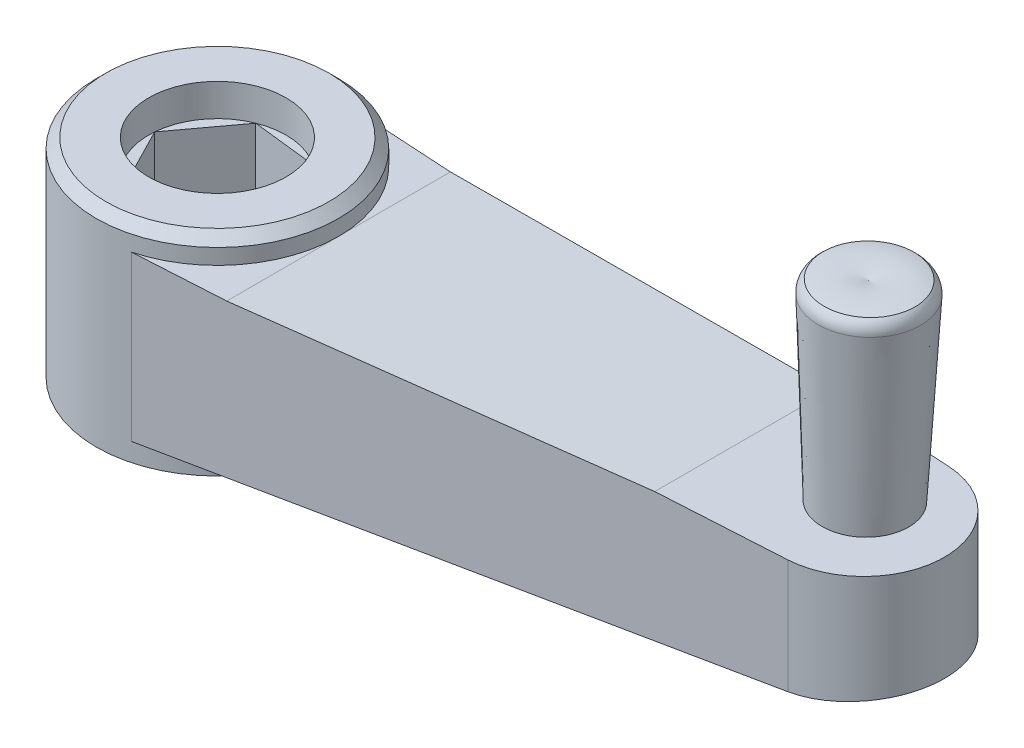
ISO-10303-21;
HEADER;
FILE_DESCRIPTION(('STEP AP214'),'2;1');
FILE_NAME('part.step','',(''),(''),'','','');
FILE_SCHEMA(('AUTOMOTIVE_DESIGN { 1 0 10303 214 1 1 1 1 }'));
ENDSEC;
DATA;
#1=APPLICATION_CONTEXT('core data for automotive mechanical design processes');
#2=APPLICATION_PROTOCOL_DEFINITION('international standard','automotive_design',2000,#1);
#3=PRODUCT_CONTEXT('',#1,'mechanical');
#4=PRODUCT('Part','Part','',(#3));
#5=PRODUCT_RELATED_PRODUCT_CATEGORY('part','',(#4));
#6=PRODUCT_DEFINITION_FORMATION('','',#4);
#7=PRODUCT_DEFINITION_CONTEXT('part definition',#1,'design');
#8=PRODUCT_DEFINITION('design','',#6,#7);
#9=PRODUCT_DEFINITION_SHAPE('','',#8);
#10=(LENGTH_UNIT() NAMED_UNIT(*) SI_UNIT(.MILLI.,.METRE.));
#11=(NAMED_UNIT(*) PLANE_ANGLE_UNIT() SI_UNIT($,.RADIAN.));
#12=(NAMED_UNIT(*) SI_UNIT($,.STERADIAN.) SOLID_ANGLE_UNIT());
#13=UNCERTAINTY_MEASURE_WITH_UNIT(LENGTH_MEASURE(1.E-05),#10,'distance_accuracy_value','');
#14=(GEOMETRIC_REPRESENTATION_CONTEXT(3) GLOBAL_UNCERTAINTY_ASSIGNED_CONTEXT((#13)) GLOBAL_UNIT_ASSIGNED_CONTEXT((#10,
#11,#12)) REPRESENTATION_CONTEXT('',''));
#15=CARTESIAN_POINT('',(0.,0.,0.));
#16=DIRECTION('',(0.,0.,1.));
#17=DIRECTION('',(1.,0.,0.));
#18=AXIS2_PLACEMENT_3D('',#15,#16,#17);
#19=CARTESIAN_POINT('',(8.5,22.,0.));
#20=DIRECTION('',(0.,1.,0.));
#21=DIRECTION('',(0.,0.,1.));
#22=AXIS2_PLACEMENT_3D('',#19,#20,#21);
#23=PLANE('',#22);
#24=DIRECTION('',(0.456272844819986,0.,0.889839924413306));
#25=VECTOR('',#24,1.);
#26=CARTESIAN_POINT('',(-4.64982391010304,22.,6.74268191360427));
#27=LINE('',#26,#25);
#28=CARTESIAN_POINT('',(-8.47042900631738,22.,-0.708401333240643));
#29=VERTEX_POINT('',#28);
#30=CARTESIAN_POINT('',(-4.36836226553078,22.,7.29159866675936));
#31=VERTEX_POINT('',#30);
#32=EDGE_CURVE('E41',#29,#31,#27,.T.);
#33=ORIENTED_EDGE('',*,*,#32,.F.);
#34=CARTESIAN_POINT('',(0.,22.,0.));
#35=DIRECTION('',(0.,1.,0.));
#36=DIRECTION('',(0.,0.,1.));
#37=AXIS2_PLACEMENT_3D('',#34,#35,#36);
#38=CIRCLE('',#37,8.5);
#39=EDGE_CURVE('E268',#29,#31,#38,.T.);
#40=ORIENTED_EDGE('',*,*,#39,.T.);
#41=EDGE_LOOP('',(#33,#40));
#42=FACE_BOUND('',#41,.T.);
#43=ADVANCED_FACE('F33',(#42),#23,.T.);
#44=DIRECTION('',(-0.594958696561607,0.,0.80375627486553));
#45=VECTOR('',#44,1.);
#46=CARTESIAN_POINT('',(-2.80206574602736,22.,-8.36604641853031));
#47=LINE('',#46,#45);
#48=CARTESIAN_POINT('',(-3.15129194618021,22.,-7.89426114781743));
#49=VERTEX_POINT('',#48);
#50=EDGE_CURVE('E258',#49,#29,#47,.T.);
#51=ORIENTED_EDGE('',*,*,#50,.F.);
#52=EDGE_CURVE('E273',#49,#29,#38,.T.);
#53=ORIENTED_EDGE('',*,*,#52,.T.);
#54=EDGE_LOOP('',(#51,#53));
#55=FACE_BOUND('',#54,.T.);
#56=ADVANCED_FACE('F277',(#55),#23,.T.);
#57=DIRECTION('',(-0.993552700765501,0.,-0.11337120799206));
#58=VECTOR('',#57,1.);
#59=CARTESIAN_POINT('',(9.23945729200637,22.,-6.48039129674904));
#60=LINE('',#59,#58);
#61=CARTESIAN_POINT('',(4.84870805381979,22.,-6.98140603380315));
#62=VERTEX_POINT('',#61);
#63=EDGE_CURVE('E256',#62,#49,#60,.T.);
#64=ORIENTED_EDGE('',*,*,#63,.F.);
#65=EDGE_CURVE('E278',#62,#49,#38,.T.);
#66=ORIENTED_EDGE('',*,*,#65,.T.);
#67=EDGE_LOOP('',(#64,#66));
#68=FACE_BOUND('',#67,.T.);
#69=ADVANCED_FACE('F308',(#68),#23,.T.);
#70=DIRECTION('',(-0.456272844819993,0.,-0.889839924413302));
#71=VECTOR('',#70,1.);
#72=CARTESIAN_POINT('',(8.44337115892086,22.,0.0290369106950027));
#73=LINE('',#72,#71);
#74=CARTESIAN_POINT('',(8.49889081237974,22.,0.137313361503261));
#75=VERTEX_POINT('',#74);
#76=EDGE_CURVE('E254',#75,#62,#73,.T.);
#77=ORIENTED_EDGE('',*,*,#76,.F.);
#78=EDGE_CURVE('E182',#75,#62,#38,.T.);
#79=ORIENTED_EDGE('',*,*,#78,.T.);
#80=EDGE_LOOP('',(#77,#79));
#81=FACE_BOUND('',#80,.T.);
#82=ADVANCED_FACE('F285',(#81),#23,.T.);
#83=DIRECTION('',(0.542487557433548,0.,-0.840063836877759));
#84=VECTOR('',#83,1.);
#85=CARTESIAN_POINT('',(8.56179425718551,22.,0.0399048431468962));
#86=LINE('',#85,#84);
#87=CARTESIAN_POINT('',(3.62172095249758,22.,7.68980736704373));
#88=VERTEX_POINT('',#87);
#89=EDGE_CURVE('E252',#88,#75,#86,.T.);
#90=ORIENTED_EDGE('',*,*,#89,.F.);
#91=EDGE_CURVE('E178',#88,#75,#38,.T.);
#92=ORIENTED_EDGE('',*,*,#91,.T.);
#93=EDGE_LOOP('',(#90,#92));
#94=FACE_BOUND('',#93,.T.);
#95=ADVANCED_FACE('F288',(#94),#23,.T.);
#96=CARTESIAN_POINT('',(0.,26.,0.));
#97=DIRECTION('',(0.,1.,0.));
#98=DIRECTION('',(0.,0.,1.));
#99=AXIS2_PLACEMENT_3D('',#96,#97,#98);
#100=PLANE('',#99);
#101=DIRECTION('',(0.,0.,-1.));
#102=VECTOR('',#101,1.);
#103=CARTESIAN_POINT('',(65.0291545189505,26.,0.));
#104=LINE('',#103,#102);
#105=CARTESIAN_POINT('',(65.0291545189505,26.,10.8983616176253));
#106=VERTEX_POINT('',#105);
#107=CARTESIAN_POINT('',(65.0291545189505,26.,-10.8983616176253));
#108=VERTEX_POINT('',#107);
#109=EDGE_CURVE('E235',#106,#108,#104,.T.);
#110=ORIENTED_EDGE('',*,*,#109,.F.);
#111=DIRECTION('',(0.998272727014016,0.,-0.05875));
#112=VECTOR('',#111,1.);
#113=CARTESIAN_POINT('',(0.863625,26.,14.674609087106));
#114=LINE('',#113,#112);
#115=CARTESIAN_POINT('',(80.5875,26.,9.98272727014016));
#116=VERTEX_POINT('',#115);
#117=EDGE_CURVE('E223',#106,#116,#114,.T.);
#118=ORIENTED_EDGE('',*,*,#117,.T.);
#119=CARTESIAN_POINT('',(80.,26.,0.));
#120=DIRECTION('',(0.,1.,0.));
#121=DIRECTION('',(0.,0.,1.));
#122=AXIS2_PLACEMENT_3D('',#119,#120,#121);
#123=CIRCLE('',#122,10.);
#124=CARTESIAN_POINT('',(80.5875,26.,-9.98272727014016));
#125=VERTEX_POINT('',#124);
#126=EDGE_CURVE('E226',#116,#125,#123,.T.);
#127=ORIENTED_EDGE('',*,*,#126,.T.);
#128=DIRECTION('',(-0.998272727014016,0.,-0.05875));
#129=VECTOR('',#128,1.);
#130=CARTESIAN_POINT('',(80.5875,26.,-9.98272727014016));
#131=LINE('',#130,#129);
#132=EDGE_CURVE('E229',#125,#108,#131,.T.);
#133=ORIENTED_EDGE('',*,*,#132,.T.);
#134=EDGE_LOOP('',(#110,#118,#127,#133));
#135=FACE_BOUND('',#134,.T.);
#136=CARTESIAN_POINT('',(80.1181305874292,26.,0.));
#137=DIRECTION('',(0.,1.,0.));
#138=DIRECTION('',(-1.,0.,0.));
#139=AXIS2_PLACEMENT_3D('',#136,#137,#138);
#140=ELLIPSE('',#139,2.88186941257082,2.88118920826868);
#141=CARTESIAN_POINT('',(77.2362611748584,26.,0.));
#142=VERTEX_POINT('',#141);
#143=EDGE_CURVE('E177',#142,#142,#140,.F.);
#144=ORIENTED_EDGE('',*,*,#143,.T.);
#145=EDGE_LOOP('',(#144));
#146=FACE_BOUND('',#145,.T.);
#147=ADVANCED_FACE('F321',(#135,#146),#100,.T.);
#148=CARTESIAN_POINT('',(0.,26.,0.));
#149=DIRECTION('',(0.,-1.,0.));
#150=DIRECTION('',(0.,0.,-1.));
#151=AXIS2_PLACEMENT_3D('',#148,#149,#150);
#152=PLANE('',#151);
#153=CARTESIAN_POINT('',(0.,26.,0.));
#154=DIRECTION('',(0.,1.,0.));
#155=DIRECTION('',(0.,0.,1.));
#156=AXIS2_PLACEMENT_3D('',#153,#154,#155);
#157=CIRCLE('',#156,13.8);
#158=CARTESIAN_POINT('',(0.,26.,13.8));
#159=VERTEX_POINT('',#158);
#160=EDGE_CURVE('E196',#159,#159,#157,.T.);
#161=ORIENTED_EDGE('',*,*,#160,.T.);
#162=EDGE_LOOP('',(#161));
#163=FACE_BOUND('',#162,.T.);
#164=CARTESIAN_POINT('',(0.,26.,0.));
#165=DIRECTION('',(0.,-1.,0.));
#166=DIRECTION('',(0.,0.,-1.));
#167=AXIS2_PLACEMENT_3D('',#164,#165,#166);
#168=CIRCLE('',#167,8.5);
#169=CARTESIAN_POINT('',(0.,26.,-8.5));
#170=VERTEX_POINT('',#169);
#171=EDGE_CURVE('E181',#170,#170,#168,.F.);
#172=ORIENTED_EDGE('',*,*,#171,.F.);
#173=EDGE_LOOP('',(#172));
#174=FACE_BOUND('',#173,.T.);
#175=ADVANCED_FACE('F326',(#163,#174),#152,.F.);
#176=CARTESIAN_POINT('',(80.5875,0.300000000000002,-9.98272727014016));
#177=DIRECTION('',(0.0587499999999999,0.,-0.998272727014016));
#178=DIRECTION('',(-0.998272727014016,0.,-0.0587499999999999));
#179=AXIS2_PLACEMENT_3D('',#176,#177,#178);
#180=PLANE('',#179);
#181=DIRECTION('',(0.991087002244832,0.119768536886839,0.0583271082202633));
#182=VECTOR('',#181,1.);
#183=CARTESIAN_POINT('',(79.2151578637604,11.6954904608239,-10.0634918731613));
#184=LINE('',#183,#182);
#185=CARTESIAN_POINT('',(3.84343146655537,2.58714641758488,-14.499242551316));
#186=VERTEX_POINT('',#185);
#187=CARTESIAN_POINT('',(80.5875,11.8613320159985,-9.98272727014016));
#188=VERTEX_POINT('',#187);
#189=EDGE_CURVE('E210',#186,#188,#184,.T.);
#190=ORIENTED_EDGE('',*,*,#189,.F.);
#191=DIRECTION('',(0.,1.,0.));
#192=VECTOR('',#191,1.);
#193=CARTESIAN_POINT('',(3.84343146655534,0.,-14.499242551316));
#194=LINE('',#193,#192);
#195=CARTESIAN_POINT('',(3.84343146655534,22.88,-14.499242551316));
#196=VERTEX_POINT('',#195);
#197=EDGE_CURVE('E202',#186,#196,#194,.T.);
#198=ORIENTED_EDGE('',*,*,#197,.T.);
#199=DIRECTION('',(-0.998272727014016,0.,-0.0587499999999999));
#200=VECTOR('',#199,1.);
#201=CARTESIAN_POINT('',(80.5875,22.88,-9.98272727014016));
#202=LINE('',#201,#200);
#203=CARTESIAN_POINT('',(15.0000000000001,22.88,-13.8426600527633));
#204=VERTEX_POINT('',#203);
#205=EDGE_CURVE('E220',#204,#196,#202,.T.);
#206=ORIENTED_EDGE('',*,*,#205,.F.);
#207=DIRECTION('',(-0.996343780024752,-0.0621356211906346,-0.0586364782813828));
#208=VECTOR('',#207,1.);
#209=CARTESIAN_POINT('',(78.9363848886131,26.867305457599,-10.0798981235242));
#210=LINE('',#209,#208);
#211=EDGE_CURVE('E218',#108,#204,#210,.T.);
#212=ORIENTED_EDGE('',*,*,#211,.F.);
#213=ORIENTED_EDGE('',*,*,#132,.F.);
#214=DIRECTION('',(0.,1.,0.));
#215=VECTOR('',#214,1.);
#216=CARTESIAN_POINT('',(80.5875,0.300000000000002,-9.98272727014016));
#217=LINE('',#216,#215);
#218=EDGE_CURVE('E233',#188,#125,#217,.T.);
#219=ORIENTED_EDGE('',*,*,#218,.F.);
#220=EDGE_LOOP('',(#190,#198,#206,#212,#213,#219));
#221=FACE_BOUND('',#220,.T.);
#222=ADVANCED_FACE('F470',(#221),#180,.T.);
#223=CARTESIAN_POINT('',(0.863625,0.300000000000002,14.674609087106));
#224=DIRECTION('',(0.05875,0.,0.998272727014016));
#225=DIRECTION('',(0.998272727014016,0.,-0.05875));
#226=AXIS2_PLACEMENT_3D('',#223,#224,#225);
#227=PLANE('',#226);
#228=DIRECTION('',(0.998272727014016,0.,-0.05875));
#229=VECTOR('',#228,1.);
#230=CARTESIAN_POINT('',(0.863624999999998,22.88,14.674609087106));
#231=LINE('',#230,#229);
#232=CARTESIAN_POINT('',(3.84343146655534,22.88,14.499242551316));
#233=VERTEX_POINT('',#232);
#234=CARTESIAN_POINT('',(15.0000000000001,22.88,13.8426600527633));
#235=VERTEX_POINT('',#234);
#236=EDGE_CURVE('E238',#233,#235,#231,.T.);
#237=ORIENTED_EDGE('',*,*,#236,.F.);
#238=DIRECTION('',(0.,1.,0.));
#239=VECTOR('',#238,1.);
#240=CARTESIAN_POINT('',(3.84343146655534,0.,14.499242551316));
#241=LINE('',#240,#239);
#242=CARTESIAN_POINT('',(3.84343146655533,2.58714641758487,14.499242551316));
#243=VERTEX_POINT('',#242);
#244=EDGE_CURVE('E199',#233,#243,#241,.F.);
#245=ORIENTED_EDGE('',*,*,#244,.T.);
#246=DIRECTION('',(-0.991087002244832,-0.119768536886839,0.0583271082202633));
#247=VECTOR('',#246,1.);
#248=CARTESIAN_POINT('',(0.634882182268532,2.1994072459098,14.6880709800117));
#249=LINE('',#248,#247);
#250=CARTESIAN_POINT('',(80.5875,11.8613320159985,9.98272727014016));
#251=VERTEX_POINT('',#250);
#252=EDGE_CURVE('E241',#251,#243,#249,.T.);
#253=ORIENTED_EDGE('',*,*,#252,.F.);
#254=DIRECTION('',(0.,1.,0.));
#255=VECTOR('',#254,1.);
#256=CARTESIAN_POINT('',(80.5875,0.300000000000002,9.98272727014016));
#257=LINE('',#256,#255);
#258=EDGE_CURVE('E232',#251,#116,#257,.T.);
#259=ORIENTED_EDGE('',*,*,#258,.T.);
#260=ORIENTED_EDGE('',*,*,#117,.F.);
#261=DIRECTION('',(0.996343780024752,0.0621356211906346,-0.0586364782813828));
#262=VECTOR('',#261,1.);
#263=CARTESIAN_POINT('',(-0.479689350907768,21.9146302822979,14.7536653569812));
#264=LINE('',#263,#262);
#265=EDGE_CURVE('E216',#235,#106,#264,.T.);
#266=ORIENTED_EDGE('',*,*,#265,.F.);
#267=EDGE_LOOP('',(#237,#245,#253,#259,#260,#266));
#268=FACE_BOUND('',#267,.T.);
#269=ADVANCED_FACE('F482',(#268),#227,.T.);
#270=CARTESIAN_POINT('',(-21.,22.88,-80.));
#271=DIRECTION('',(0.,-1.,0.));
#272=DIRECTION('',(1.,0.,0.));
#273=AXIS2_PLACEMENT_3D('',#270,#271,#272);
#274=PLANE('',#273);
#275=CARTESIAN_POINT('',(0.,22.88,0.));
#276=DIRECTION('',(0.,-1.,0.));
#277=DIRECTION('',(1.,0.,0.));
#278=AXIS2_PLACEMENT_3D('',#275,#276,#277);
#279=CIRCLE('',#278,15.);
#280=CARTESIAN_POINT('',(15.0000000000001,22.88,0.));
#281=VERTEX_POINT('',#280);
#282=EDGE_CURVE('E207',#281,#196,#279,.F.);
#283=ORIENTED_EDGE('',*,*,#282,.F.);
#284=DIRECTION('',(0.,0.,1.));
#285=VECTOR('',#284,1.);
#286=CARTESIAN_POINT('',(15.0000000000001,22.88,-80.));
#287=LINE('',#286,#285);
#288=EDGE_CURVE('E213',#204,#281,#287,.T.);
#289=ORIENTED_EDGE('',*,*,#288,.F.);
#290=ORIENTED_EDGE('',*,*,#205,.T.);
#291=EDGE_LOOP('',(#283,#289,#290));
#292=FACE_BOUND('',#291,.T.);
#293=ADVANCED_FACE('F491',(#292),#274,.F.);
#294=EDGE_CURVE('E204',#233,#281,#279,.F.);
#295=ORIENTED_EDGE('',*,*,#294,.F.);
#296=ORIENTED_EDGE('',*,*,#236,.T.);
#297=EDGE_CURVE('E212',#281,#235,#287,.T.);
#298=ORIENTED_EDGE('',*,*,#297,.F.);
#299=EDGE_LOOP('',(#295,#296,#298));
#300=FACE_BOUND('',#299,.T.);
#301=ADVANCED_FACE('F498',(#300),#274,.F.);
#302=CARTESIAN_POINT('',(90.01,13.,-80.));
#303=DIRECTION('',(-0.1199727875568,0.992777180562613,0.));
#304=DIRECTION('',(-0.992777180562613,-0.1199727875568,0.));
#305=AXIS2_PLACEMENT_3D('',#302,#303,#304);
#306=PLANE('',#305);
#307=CARTESIAN_POINT('',(0.,2.1226845062375,0.));
#308=DIRECTION('',(-0.1199727875568,0.992777180562613,0.));
#309=DIRECTION('',(0.992777180562613,0.1199727875568,0.));
#310=AXIS2_PLACEMENT_3D('',#307,#308,#309);
#311=ELLIPSE('',#310,15.1091305216135,15.);
#312=EDGE_CURVE('E243',#186,#243,#311,.F.);
#313=ORIENTED_EDGE('',*,*,#312,.F.);
#314=ORIENTED_EDGE('',*,*,#189,.T.);
#315=CARTESIAN_POINT('',(80.,11.7903352061708,0.));
#316=DIRECTION('',(-0.1199727875568,0.992777180562613,0.));
#317=DIRECTION('',(0.992777180562613,0.1199727875568,0.));
#318=AXIS2_PLACEMENT_3D('',#315,#316,#317);
#319=ELLIPSE('',#318,10.0727536810757,10.);
#320=EDGE_CURVE('E208',#188,#251,#319,.F.);
#321=ORIENTED_EDGE('',*,*,#320,.T.);
#322=ORIENTED_EDGE('',*,*,#252,.T.);
#323=EDGE_LOOP('',(#313,#314,#321,#322));
#324=FACE_BOUND('',#323,.T.);
#325=ADVANCED_FACE('F506',(#324),#306,.F.);
#326=CARTESIAN_POINT('',(80.,0.300000000000002,0.));
#327=DIRECTION('',(0.,1.,0.));
#328=DIRECTION('',(0.,0.,1.));
#329=AXIS2_PLACEMENT_3D('',#326,#327,#328);
#330=CYLINDRICAL_SURFACE('',#329,10.);
#331=ORIENTED_EDGE('',*,*,#320,.F.);
#332=ORIENTED_EDGE('',*,*,#218,.T.);
#333=ORIENTED_EDGE('',*,*,#126,.F.);
#334=ORIENTED_EDGE('',*,*,#258,.F.);
#335=EDGE_LOOP('',(#331,#332,#333,#334));
#336=FACE_BOUND('',#335,.T.);
#337=ADVANCED_FACE('F513',(#336),#330,.T.);
#338=CARTESIAN_POINT('',(15.0000000000001,22.88,-80.));
#339=DIRECTION('',(0.0622427159156604,-0.998061042379394,0.));
#340=DIRECTION('',(0.998061042379394,0.0622427159156604,0.));
#341=AXIS2_PLACEMENT_3D('',#338,#339,#340);
#342=PLANE('',#341);
#343=ORIENTED_EDGE('',*,*,#211,.T.);
#344=ORIENTED_EDGE('',*,*,#288,.T.);
#345=ORIENTED_EDGE('',*,*,#297,.T.);
#346=ORIENTED_EDGE('',*,*,#265,.T.);
#347=ORIENTED_EDGE('',*,*,#109,.T.);
#348=EDGE_LOOP('',(#343,#344,#345,#346,#347));
#349=FACE_BOUND('',#348,.T.);
#350=ADVANCED_FACE('F521',(#349),#342,.F.);
#351=CARTESIAN_POINT('',(0.,0.,0.));
#352=DIRECTION('',(0.,1.,0.));
#353=DIRECTION('',(0.,0.,1.));
#354=AXIS2_PLACEMENT_3D('',#351,#352,#353);
#355=CYLINDRICAL_SURFACE('',#354,15.);
#356=CARTESIAN_POINT('',(0.,0.300000000000001,0.));
#357=DIRECTION('',(0.,1.,0.));
#358=DIRECTION('',(0.,0.,1.));
#359=AXIS2_PLACEMENT_3D('',#356,#357,#358);
#360=CIRCLE('',#359,15.);
#361=CARTESIAN_POINT('',(0.,0.300000000000001,15.));
#362=VERTEX_POINT('',#361);
#363=EDGE_CURVE('E190',#362,#362,#360,.T.);
#364=ORIENTED_EDGE('',*,*,#363,.T.);
#365=EDGE_LOOP('',(#364));
#366=FACE_BOUND('',#365,.T.);
#367=CARTESIAN_POINT('',(0.,24.8,0.));
#368=DIRECTION('',(0.,1.,0.));
#369=DIRECTION('',(0.,0.,1.));
#370=AXIS2_PLACEMENT_3D('',#367,#368,#369);
#371=CIRCLE('',#370,15.);
#372=CARTESIAN_POINT('',(0.,24.8,15.));
#373=VERTEX_POINT('',#372);
#374=EDGE_CURVE('E193',#373,#373,#371,.T.);
#375=ORIENTED_EDGE('',*,*,#374,.F.);
#376=EDGE_LOOP('',(#375));
#377=FACE_BOUND('',#376,.T.);
#378=ORIENTED_EDGE('',*,*,#294,.T.);
#379=ORIENTED_EDGE('',*,*,#282,.T.);
#380=ORIENTED_EDGE('',*,*,#197,.F.);
#381=ORIENTED_EDGE('',*,*,#312,.T.);
#382=ORIENTED_EDGE('',*,*,#244,.F.);
#383=EDGE_LOOP('',(#378,#379,#380,#381,#382));
#384=FACE_BOUND('',#383,.T.);
#385=ADVANCED_FACE('F528',(#366,#377,#384),#355,.T.);
#386=CARTESIAN_POINT('',(0.,24.8,0.));
#387=DIRECTION('',(0.,-1.,0.));
#388=DIRECTION('',(0.,0.,-1.));
#389=AXIS2_PLACEMENT_3D('',#386,#387,#388);
#390=CONICAL_SURFACE('',#389,15.,0.785398163397448);
#391=ORIENTED_EDGE('',*,*,#160,.F.);
#392=EDGE_LOOP('',(#391));
#393=FACE_BOUND('',#392,.T.);
#394=ORIENTED_EDGE('',*,*,#374,.T.);
#395=EDGE_LOOP('',(#394));
#396=FACE_BOUND('',#395,.T.);
#397=ADVANCED_FACE('F536',(#393,#396),#390,.T.);
#398=CARTESIAN_POINT('',(15.,0.3,0.));
#399=DIRECTION('',(0.,1.,0.));
#400=DIRECTION('',(0.,0.,1.));
#401=AXIS2_PLACEMENT_3D('',#398,#399,#400);
#402=PLANE('',#401);
#403=ORIENTED_EDGE('',*,*,#363,.F.);
#404=EDGE_LOOP('',(#403));
#405=FACE_BOUND('',#404,.T.);
#406=CARTESIAN_POINT('',(0.,0.3,0.));
#407=DIRECTION('',(0.,1.,0.));
#408=DIRECTION('',(0.,0.,1.));
#409=AXIS2_PLACEMENT_3D('',#406,#407,#408);
#410=CIRCLE('',#409,11.);
#411=CARTESIAN_POINT('',(0.,0.3,11.));
#412=VERTEX_POINT('',#411);
#413=EDGE_CURVE('E187',#412,#412,#410,.T.);
#414=ORIENTED_EDGE('',*,*,#413,.T.);
#415=EDGE_LOOP('',(#414));
#416=FACE_BOUND('',#415,.T.);
#417=ADVANCED_FACE('F544',(#405,#416),#402,.F.);
#418=CARTESIAN_POINT('',(0.,0.,0.));
#419=DIRECTION('',(0.,1.,0.));
#420=DIRECTION('',(0.,0.,1.));
#421=AXIS2_PLACEMENT_3D('',#418,#419,#420);
#422=CYLINDRICAL_SURFACE('',#421,11.);
#423=ORIENTED_EDGE('',*,*,#413,.F.);
#424=EDGE_LOOP('',(#423));
#425=FACE_BOUND('',#424,.T.);
#426=CARTESIAN_POINT('',(0.,0.,0.));
#427=DIRECTION('',(0.,1.,0.));
#428=DIRECTION('',(0.,0.,1.));
#429=AXIS2_PLACEMENT_3D('',#426,#427,#428);
#430=CIRCLE('',#429,11.);
#431=CARTESIAN_POINT('',(0.,0.,11.));
#432=VERTEX_POINT('',#431);
#433=EDGE_CURVE('E184',#432,#432,#430,.T.);
#434=ORIENTED_EDGE('',*,*,#433,.T.);
#435=EDGE_LOOP('',(#434));
#436=FACE_BOUND('',#435,.T.);
#437=ADVANCED_FACE('F461',(#425,#436),#422,.T.);
#438=CARTESIAN_POINT('',(11.,0.,0.));
#439=DIRECTION('',(0.,1.,0.));
#440=DIRECTION('',(0.,0.,1.));
#441=AXIS2_PLACEMENT_3D('',#438,#439,#440);
#442=PLANE('',#441);
#443=DIRECTION('',(-0.594958696561607,0.,0.80375627486553));
#444=VECTOR('',#443,1.);
#445=CARTESIAN_POINT('',(-3.15129194618021,0.,-7.89426114781743));
#446=LINE('',#445,#444);
#447=CARTESIAN_POINT('',(-3.15129194618021,0.,-7.89426114781743));
#448=VERTEX_POINT('',#447);
#449=CARTESIAN_POINT('',(-8.47042900631738,0.,-0.708401333240643));
#450=VERTEX_POINT('',#449);
#451=EDGE_CURVE('E136',#448,#450,#446,.T.);
#452=ORIENTED_EDGE('',*,*,#451,.T.);
#453=DIRECTION('',(0.456272844819986,0.,0.889839924413305));
#454=VECTOR('',#453,1.);
#455=CARTESIAN_POINT('',(-8.47042900631738,0.,-0.708401333240643));
#456=LINE('',#455,#454);
#457=CARTESIAN_POINT('',(-4.36836226553078,0.,7.29159866675936));
#458=VERTEX_POINT('',#457);
#459=EDGE_CURVE('E131',#450,#458,#456,.T.);
#460=ORIENTED_EDGE('',*,*,#459,.T.);
#461=DIRECTION('',(0.99876040225354,0.,0.0497760875355466));
#462=VECTOR('',#461,1.);
#463=CARTESIAN_POINT('',(-4.36836226553078,0.,7.29159866675936));
#464=LINE('',#463,#462);
#465=CARTESIAN_POINT('',(3.62172095249758,0.,7.68980736704373));
#466=VERTEX_POINT('',#465);
#467=EDGE_CURVE('E139',#458,#466,#464,.T.);
#468=ORIENTED_EDGE('',*,*,#467,.T.);
#469=DIRECTION('',(0.542487557433548,0.,-0.840063836877759));
#470=VECTOR('',#469,1.);
#471=CARTESIAN_POINT('',(3.62172095249758,0.,7.68980736704373));
#472=LINE('',#471,#470);
#473=CARTESIAN_POINT('',(8.49889081237974,0.,0.137313361503261));
#474=VERTEX_POINT('',#473);
#475=EDGE_CURVE('E48',#466,#474,#472,.T.);
#476=ORIENTED_EDGE('',*,*,#475,.T.);
#477=DIRECTION('',(-0.456272844819993,0.,-0.889839924413302));
#478=VECTOR('',#477,1.);
#479=CARTESIAN_POINT('',(8.49889081237974,0.,0.137313361503261));
#480=LINE('',#479,#478);
#481=CARTESIAN_POINT('',(4.84870805381979,0.,-6.98140603380315));
#482=VERTEX_POINT('',#481);
#483=EDGE_CURVE('E150',#474,#482,#480,.T.);
#484=ORIENTED_EDGE('',*,*,#483,.T.);
#485=DIRECTION('',(-0.993552700765501,0.,-0.11337120799206));
#486=VECTOR('',#485,1.);
#487=CARTESIAN_POINT('',(4.84870805381979,0.,-6.98140603380315));
#488=LINE('',#487,#486);
#489=EDGE_CURVE('E153',#482,#448,#488,.T.);
#490=ORIENTED_EDGE('',*,*,#489,.T.);
#491=EDGE_LOOP('',(#452,#460,#468,#476,#484,#490));
#492=FACE_BOUND('',#491,.T.);
#493=ORIENTED_EDGE('',*,*,#433,.F.);
#494=EDGE_LOOP('',(#493));
#495=FACE_BOUND('',#494,.T.);
#496=ADVANCED_FACE('F143',(#492,#495),#442,.F.);
#497=CARTESIAN_POINT('',(0.,22.,0.));
#498=DIRECTION('',(0.,1.,0.));
#499=DIRECTION('',(0.,0.,1.));
#500=AXIS2_PLACEMENT_3D('',#497,#498,#499);
#501=CYLINDRICAL_SURFACE('',#500,8.5);
#502=ORIENTED_EDGE('',*,*,#171,.T.);
#503=EDGE_LOOP('',(#502));
#504=FACE_BOUND('',#503,.T.);
#505=ORIENTED_EDGE('',*,*,#39,.F.);
#506=ORIENTED_EDGE('',*,*,#52,.F.);
#507=ORIENTED_EDGE('',*,*,#65,.F.);
#508=ORIENTED_EDGE('',*,*,#78,.F.);
#509=ORIENTED_EDGE('',*,*,#91,.F.);
#510=EDGE_CURVE('E183',#31,#88,#38,.T.);
#511=ORIENTED_EDGE('',*,*,#510,.F.);
#512=EDGE_LOOP('',(#505,#506,#507,#508,#509,#511));
#513=FACE_BOUND('',#512,.T.);
#514=ADVANCED_FACE('F271',(#504,#513),#501,.F.);
#515=DIRECTION('',(0.99876040225354,0.,0.0497760875355466));
#516=VECTOR('',#515,1.);
#517=CARTESIAN_POINT('',(8.10561924291546,22.,7.91327529118323));
#518=LINE('',#517,#516);
#519=EDGE_CURVE('E246',#31,#88,#518,.T.);
#520=ORIENTED_EDGE('',*,*,#519,.F.);
#521=ORIENTED_EDGE('',*,*,#510,.T.);
#522=EDGE_LOOP('',(#520,#521));
#523=FACE_BOUND('',#522,.T.);
#524=ADVANCED_FACE('F290',(#523),#23,.T.);
#525=CARTESIAN_POINT('',(77.2756894678995,38.5558554976199,0.));
#526=DIRECTION('',(0.,0.,-1.));
#527=DIRECTION('',(-0.999764082524,0.0217204810016939,0.));
#528=AXIS2_PLACEMENT_3D('',#525,#526,#527);
#529=CIRCLE('',#528,12.8968253968254);
#530=TRIMMED_CURVE('',#529,(PARAMETER_VALUE(-1.81480882160338)),
(PARAMETER_VALUE(1.81480882160338)),.T.,.PARAMETER.);
#531=CARTESIAN_POINT('',(80.3908040704473,38.4881777437122,0.));
#532=DIRECTION('',(0.0217204810016939,0.999764082524,0.));
#533=AXIS1_PLACEMENT('',#531,#532);
#534=SURFACE_OF_REVOLUTION('',#530,#533);
#535=CARTESIAN_POINT('',(80.6626309967839,51.,0.));
#536=VERTEX_POINT('',#535);
#537=VERTEX_LOOP('',#536);
#538=FACE_BOUND('',#537,.T.);
#539=CARTESIAN_POINT('',(80.6653138052944,51.1234860125241,0.));
#540=DIRECTION('',(0.0217204810016939,0.999764082524,0.));
#541=DIRECTION('',(-0.999764082524,0.0217204810016939,0.));
#542=AXIS2_PLACEMENT_3D('',#539,#540,#541);
#543=CIRCLE('',#542,5.68523378991818);
#544=CARTESIAN_POINT('',(74.9814212613824,51.2469720250482,0.));
#545=VERTEX_POINT('',#544);
#546=EDGE_CURVE('E174',#545,#545,#543,.T.);
#547=ORIENTED_EDGE('',*,*,#546,.T.);
#548=EDGE_LOOP('',(#547));
#549=FACE_BOUND('',#548,.T.);
#550=ADVANCED_FACE('F312',(#538,#549),#534,.T.);
#551=CARTESIAN_POINT('',(80.1437708150272,27.1175743054753,0.));
#552=DIRECTION('',(0.0217204810016939,0.999764082524,0.));
#553=DIRECTION('',(-0.999764082524,0.0217204810016939,0.));
#554=AXIS2_PLACEMENT_3D('',#551,#552,#553);
#555=CONICAL_SURFACE('',#554,5.41306177640011,0.0443191967059719);
#556=CARTESIAN_POINT('',(80.6299652601993,49.4964407480677,0.));
#557=DIRECTION('',(-0.0217204810016939,-0.999764082524,0.));
#558=DIRECTION('',(0.999764082524,-0.0217204810016939,0.));
#559=AXIS2_PLACEMENT_3D('',#556,#557,#558);
#560=CIRCLE('',#559,6.40575923597859);
#561=CARTESIAN_POINT('',(87.0342132656271,49.3573045762813,0.));
#562=VERTEX_POINT('',#561);
#563=EDGE_CURVE('E11',#562,#562,#560,.T.);
#564=ORIENTED_EDGE('',*,*,#563,.T.);
#565=EDGE_LOOP('',(#564));
#566=FACE_BOUND('',#565,.T.);
#567=CARTESIAN_POINT('',(80.1437708150272,27.1175743054753,0.));
#568=DIRECTION('',(0.0217204810016939,0.999764082524,0.));
#569=DIRECTION('',(-0.999764082524,0.0217204810016939,0.));
#570=AXIS2_PLACEMENT_3D('',#567,#568,#569);
#571=CIRCLE('',#570,5.41306177640011);
#572=CARTESIAN_POINT('',(74.7319860744988,27.2351486109506,0.));
#573=VERTEX_POINT('',#572);
#574=EDGE_CURVE('E171',#573,#573,#571,.T.);
#575=ORIENTED_EDGE('',*,*,#574,.T.);
#576=EDGE_LOOP('',(#575));
#577=FACE_BOUND('',#576,.T.);
#578=ADVANCED_FACE('F317',(#566,#577),#555,.T.);
#579=CARTESIAN_POINT('',(80.142565156829,27.0620795048648,0.));
#580=DIRECTION('',(0.0217204810016939,0.999764082524,0.));
#581=DIRECTION('',(-0.999764082524,0.0217204810016939,0.));
#582=AXIS2_PLACEMENT_3D('',#579,#580,#581);
#583=CONICAL_SURFACE('',#582,2.85810912106099,1.54907413755165);
#584=ORIENTED_EDGE('',*,*,#574,.F.);
#585=EDGE_LOOP('',(#584));
#586=FACE_BOUND('',#585,.T.);
#587=CARTESIAN_POINT('',(80.142565156829,27.0620795048648,0.));
#588=DIRECTION('',(0.0217204810016939,0.999764082524,0.));
#589=DIRECTION('',(-0.999764082524,0.0217204810016939,0.));
#590=AXIS2_PLACEMENT_3D('',#587,#588,#589);
#591=CIRCLE('',#590,2.85810912106099);
#592=CARTESIAN_POINT('',(77.285130313658,27.1241590097295,0.));
#593=VERTEX_POINT('',#592);
#594=EDGE_CURVE('E158',#593,#593,#591,.T.);
#595=ORIENTED_EDGE('',*,*,#594,.T.);
#596=EDGE_LOOP('',(#595));
#597=FACE_BOUND('',#596,.T.);
#598=ADVANCED_FACE('F351',(#586,#597),#583,.T.);
#599=CARTESIAN_POINT('',(80.0147377092575,21.1783566336845,0.));
#600=DIRECTION('',(-0.0217204810016939,-0.999764082524,0.));
#601=DIRECTION('',(0.999764082524,-0.0217204810016939,0.));
#602=AXIS2_PLACEMENT_3D('',#599,#600,#601);
#603=CONICAL_SURFACE('',#602,2.98596673247746,0.0217221892432496);
#604=ORIENTED_EDGE('',*,*,#143,.F.);
#605=EDGE_LOOP('',(#604));
#606=FACE_BOUND('',#605,.T.);
#607=ORIENTED_EDGE('',*,*,#594,.F.);
#608=EDGE_LOOP('',(#607));
#609=FACE_BOUND('',#608,.T.);
#610=ADVANCED_FACE('F346',(#606,#609),#603,.T.);
#611=CARTESIAN_POINT('',(-8.47042900631738,0.,-0.708401333240643));
#612=DIRECTION('',(-0.889839924413305,0.,0.456272844819986));
#613=DIRECTION('',(0.456272844819986,0.,0.889839924413306));
#614=AXIS2_PLACEMENT_3D('',#611,#612,#613);
#615=PLANE('',#614);
#616=ORIENTED_EDGE('',*,*,#32,.T.);
#617=DIRECTION('',(0.,1.,0.));
#618=VECTOR('',#617,1.);
#619=CARTESIAN_POINT('',(-4.36836226553078,0.,7.29159866675936));
#620=LINE('',#619,#618);
#621=EDGE_CURVE('E56',#458,#31,#620,.T.);
#622=ORIENTED_EDGE('',*,*,#621,.F.);
#623=ORIENTED_EDGE('',*,*,#459,.F.);
#624=DIRECTION('',(0.,1.,0.));
#625=VECTOR('',#624,1.);
#626=CARTESIAN_POINT('',(-8.47042900631738,0.,-0.708401333240643));
#627=LINE('',#626,#625);
#628=EDGE_CURVE('E156',#450,#29,#627,.T.);
#629=ORIENTED_EDGE('',*,*,#628,.T.);
#630=EDGE_LOOP('',(#616,#622,#623,#629));
#631=FACE_BOUND('',#630,.T.);
#632=ADVANCED_FACE('F128',(#631),#615,.F.);
#633=CARTESIAN_POINT('',(-3.15129194618021,0.,-7.89426114781743));
#634=DIRECTION('',(-0.80375627486553,0.,-0.594958696561607));
#635=DIRECTION('',(-0.594958696561607,0.,0.80375627486553));
#636=AXIS2_PLACEMENT_3D('',#633,#634,#635);
#637=PLANE('',#636);
#638=ORIENTED_EDGE('',*,*,#50,.T.);
#639=ORIENTED_EDGE('',*,*,#628,.F.);
#640=ORIENTED_EDGE('',*,*,#451,.F.);
#641=DIRECTION('',(0.,1.,0.));
#642=VECTOR('',#641,1.);
#643=CARTESIAN_POINT('',(-3.15129194618021,0.,-7.89426114781743));
#644=LINE('',#643,#642);
#645=EDGE_CURVE('E159',#448,#49,#644,.T.);
#646=ORIENTED_EDGE('',*,*,#645,.T.);
#647=EDGE_LOOP('',(#638,#639,#640,#646));
#648=FACE_BOUND('',#647,.T.);
#649=ADVANCED_FACE('F261',(#648),#637,.F.);
#650=CARTESIAN_POINT('',(4.84870805381979,0.,-6.98140603380315));
#651=DIRECTION('',(0.11337120799206,0.,-0.993552700765501));
#652=DIRECTION('',(-0.993552700765501,0.,-0.11337120799206));
#653=AXIS2_PLACEMENT_3D('',#650,#651,#652);
#654=PLANE('',#653);
#655=ORIENTED_EDGE('',*,*,#63,.T.);
#656=ORIENTED_EDGE('',*,*,#645,.F.);
#657=ORIENTED_EDGE('',*,*,#489,.F.);
#658=DIRECTION('',(0.,1.,0.));
#659=VECTOR('',#658,1.);
#660=CARTESIAN_POINT('',(4.84870805381979,0.,-6.98140603380315));
#661=LINE('',#660,#659);
#662=EDGE_CURVE('E162',#482,#62,#661,.T.);
#663=ORIENTED_EDGE('',*,*,#662,.T.);
#664=EDGE_LOOP('',(#655,#656,#657,#663));
#665=FACE_BOUND('',#664,.T.);
#666=ADVANCED_FACE('F300',(#665),#654,.F.);
#667=CARTESIAN_POINT('',(8.49889081237974,0.,0.137313361503261));
#668=DIRECTION('',(0.889839924413302,0.,-0.456272844819993));
#669=DIRECTION('',(-0.456272844819993,0.,-0.889839924413302));
#670=AXIS2_PLACEMENT_3D('',#667,#668,#669);
#671=PLANE('',#670);
#672=ORIENTED_EDGE('',*,*,#76,.T.);
#673=ORIENTED_EDGE('',*,*,#662,.F.);
#674=ORIENTED_EDGE('',*,*,#483,.F.);
#675=DIRECTION('',(0.,1.,0.));
#676=VECTOR('',#675,1.);
#677=CARTESIAN_POINT('',(8.49889081237974,0.,0.137313361503261));
#678=LINE('',#677,#676);
#679=EDGE_CURVE('E165',#474,#75,#678,.T.);
#680=ORIENTED_EDGE('',*,*,#679,.T.);
#681=EDGE_LOOP('',(#672,#673,#674,#680));
#682=FACE_BOUND('',#681,.T.);
#683=ADVANCED_FACE('F293',(#682),#671,.F.);
#684=CARTESIAN_POINT('',(3.62172095249758,0.,7.68980736704373));
#685=DIRECTION('',(0.840063836877759,0.,0.542487557433548));
#686=DIRECTION('',(0.542487557433548,0.,-0.840063836877759));
#687=AXIS2_PLACEMENT_3D('',#684,#685,#686);
#688=PLANE('',#687);
#689=ORIENTED_EDGE('',*,*,#89,.T.);
#690=ORIENTED_EDGE('',*,*,#679,.F.);
#691=ORIENTED_EDGE('',*,*,#475,.F.);
#692=DIRECTION('',(0.,1.,0.));
#693=VECTOR('',#692,1.);
#694=CARTESIAN_POINT('',(3.62172095249758,0.,7.68980736704373));
#695=LINE('',#694,#693);
#696=EDGE_CURVE('E135',#466,#88,#695,.T.);
#697=ORIENTED_EDGE('',*,*,#696,.T.);
#698=EDGE_LOOP('',(#689,#690,#691,#697));
#699=FACE_BOUND('',#698,.T.);
#700=ADVANCED_FACE('F291',(#699),#688,.F.);
#701=CARTESIAN_POINT('',(-4.36836226553078,0.,7.29159866675936));
#702=DIRECTION('',(-0.0497760875355466,0.,0.99876040225354));
#703=DIRECTION('',(0.99876040225354,0.,0.0497760875355466));
#704=AXIS2_PLACEMENT_3D('',#701,#702,#703);
#705=PLANE('',#704);
#706=ORIENTED_EDGE('',*,*,#519,.T.);
#707=ORIENTED_EDGE('',*,*,#696,.F.);
#708=ORIENTED_EDGE('',*,*,#467,.F.);
#709=ORIENTED_EDGE('',*,*,#621,.T.);
#710=EDGE_LOOP('',(#706,#707,#708,#709));
#711=FACE_BOUND('',#710,.T.);
#712=ADVANCED_FACE('F140',(#711),#705,.F.);
#713=CARTESIAN_POINT('',(80.6318898985354,49.5850292227029,0.));
#714=DIRECTION('',(0.0217204810016939,0.999764082524,0.));
#715=DIRECTION('',(-0.999764082524,0.0217204810016939,0.));
#716=AXIS2_PLACEMENT_3D('',#713,#714,#715);
#717=TOROIDAL_SURFACE('',#716,4.40772310569238,2.);
#718=ORIENTED_EDGE('',*,*,#563,.F.);
#719=EDGE_LOOP('',(#718));
#720=FACE_BOUND('',#719,.T.);
#721=ORIENTED_EDGE('',*,*,#546,.F.);
#722=EDGE_LOOP('',(#721));
#723=FACE_BOUND('',#722,.T.);
#724=ADVANCED_FACE('F35',(#720,#723),#717,.T.);
#725=CLOSED_SHELL('',(#43,#56,#69,#82,#95,#147,#175,#222,#269,#293,#301,#325,#337,#350,#385,
#397,#417,#437,#496,#514,#524,#550,#578,#598,#610,#632,#649,#666,#683,#700,#712,#724));
#726=MANIFOLD_SOLID_BREP('B2',#725);
#727=ADVANCED_BREP_SHAPE_REPRESENTATION('',(#18,#726),#14);
#728=SHAPE_DEFINITION_REPRESENTATION(#9,#727);
ENDSEC;
END-ISO-10303-21;
